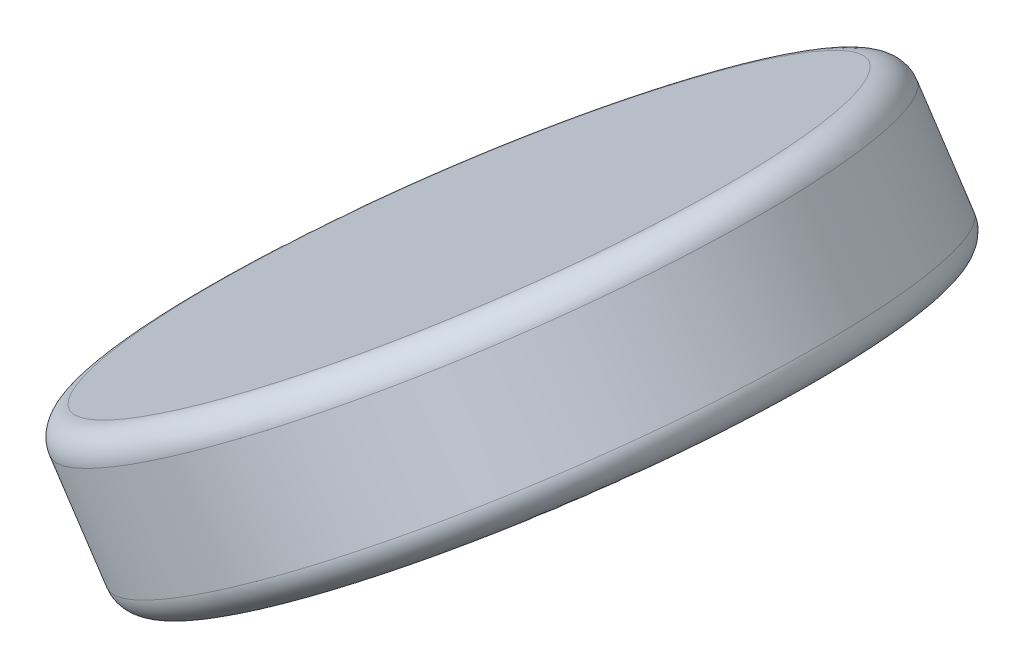
ISO-10303-21;
HEADER;
FILE_DESCRIPTION(('STEP AP214'),'2;1');
FILE_NAME('part.step','',(''),(''),'','','');
FILE_SCHEMA(('AUTOMOTIVE_DESIGN { 1 0 10303 214 1 1 1 1 }'));
ENDSEC;
DATA;
#1=APPLICATION_CONTEXT('core data for automotive mechanical design processes');
#2=APPLICATION_PROTOCOL_DEFINITION('international standard','automotive_design',2000,#1);
#3=PRODUCT_CONTEXT('',#1,'mechanical');
#4=PRODUCT('Part','Part','',(#3));
#5=PRODUCT_RELATED_PRODUCT_CATEGORY('part','',(#4));
#6=PRODUCT_DEFINITION_FORMATION('','',#4);
#7=PRODUCT_DEFINITION_CONTEXT('part definition',#1,'design');
#8=PRODUCT_DEFINITION('design','',#6,#7);
#9=PRODUCT_DEFINITION_SHAPE('','',#8);
#10=(LENGTH_UNIT() NAMED_UNIT(*) SI_UNIT(.MILLI.,.METRE.));
#11=(NAMED_UNIT(*) PLANE_ANGLE_UNIT() SI_UNIT($,.RADIAN.));
#12=(NAMED_UNIT(*) SI_UNIT($,.STERADIAN.) SOLID_ANGLE_UNIT());
#13=UNCERTAINTY_MEASURE_WITH_UNIT(LENGTH_MEASURE(1.E-05),#10,'distance_accuracy_value','');
#14=(GEOMETRIC_REPRESENTATION_CONTEXT(3) GLOBAL_UNCERTAINTY_ASSIGNED_CONTEXT((#13)) GLOBAL_UNIT_ASSIGNED_CONTEXT((#10,
#11,#12)) REPRESENTATION_CONTEXT('',''));
#15=CARTESIAN_POINT('',(0.,0.,0.));
#16=DIRECTION('',(0.,0.,1.));
#17=DIRECTION('',(1.,0.,0.));
#18=AXIS2_PLACEMENT_3D('',#15,#16,#17);
#19=CARTESIAN_POINT('',(72.0948800223047,-6.29929521021948,0.));
#20=DIRECTION('',(-0.555551246362452,0.831482298467698,0.));
#21=DIRECTION('',(-0.831482298467698,-0.555551246362452,0.));
#22=AXIS2_PLACEMENT_3D('',#19,#20,#21);
#23=PLANE('',#22);
#24=CARTESIAN_POINT('',(66.6902450822647,-9.91037831157542,0.));
#25=DIRECTION('',(-0.555551246362452,0.831482298467698,0.));
#26=DIRECTION('',(-0.831482298467698,-0.555551246362452,0.));
#27=AXIS2_PLACEMENT_3D('',#24,#25,#26);
#28=CIRCLE('',#27,6.00000000000001);
#29=CARTESIAN_POINT('',(61.7013512914585,-13.2436857897501,0.));
#30=VERTEX_POINT('',#29);
#31=CARTESIAN_POINT('',(71.6791388730709,-6.5770708334007,0.));
#32=VERTEX_POINT('',#31);
#33=EDGE_CURVE('E42',#30,#32,#28,.T.);
#34=ORIENTED_EDGE('',*,*,#33,.F.);
#35=CARTESIAN_POINT('',(66.6902450822647,-9.91037831157542,0.));
#36=DIRECTION('',(-0.555551246362452,0.831482298467698,0.));
#37=DIRECTION('',(0.831482298467698,0.555551246362451,0.));
#38=AXIS2_PLACEMENT_3D('',#35,#36,#37);
#39=CIRCLE('',#38,6.00000000000002);
#40=EDGE_CURVE('E44',#32,#30,#39,.T.);
#41=ORIENTED_EDGE('',*,*,#40,.F.);
#42=EDGE_LOOP('',(#34,#41));
#43=FACE_BOUND('',#42,.T.);
#44=ADVANCED_FACE('F17',(#43),#23,.F.);
#45=CARTESIAN_POINT('',(66.4124694590834,-9.49463716234157,0.));
#46=DIRECTION('',(-0.555551246362452,0.831482298467698,0.));
#47=DIRECTION('',(-0.831482298467698,-0.555551246362452,0.));
#48=AXIS2_PLACEMENT_3D('',#45,#46,#47);
#49=TOROIDAL_SURFACE('',#48,6.00000000000001,0.5);
#50=ORIENTED_EDGE('',*,*,#33,.T.);
#51=ORIENTED_EDGE('',*,*,#40,.T.);
#52=EDGE_LOOP('',(#50,#51));
#53=FACE_BOUND('',#52,.T.);
#54=CARTESIAN_POINT('',(66.4124694590835,-9.49463716234157,0.));
#55=DIRECTION('',(-0.555551246362452,0.831482298467698,0.));
#56=DIRECTION('',(-0.831482298467698,-0.555551246362452,0.));
#57=AXIS2_PLACEMENT_3D('',#54,#55,#56);
#58=CIRCLE('',#57,6.50000000000001);
#59=CARTESIAN_POINT('',(61.0078345190434,-13.1057202636975,0.));
#60=VERTEX_POINT('',#59);
#61=EDGE_CURVE('E50',#60,#60,#58,.T.);
#62=ORIENTED_EDGE('',*,*,#61,.F.);
#63=EDGE_LOOP('',(#62));
#64=FACE_BOUND('',#63,.T.);
#65=ADVANCED_FACE('F46',(#53,#64),#49,.T.);
#66=CARTESIAN_POINT('',(58.7203402362504,2.01801685146834,0.));
#67=DIRECTION('',(-0.555551246362452,0.831482298467698,0.));
#68=DIRECTION('',(-0.831482298467698,-0.555551246362452,0.));
#69=AXIS2_PLACEMENT_3D('',#66,#67,#68);
#70=CYLINDRICAL_SURFACE('',#69,6.50000000000001);
#71=ORIENTED_EDGE('',*,*,#61,.T.);
#72=EDGE_LOOP('',(#71));
#73=FACE_BOUND('',#72,.T.);
#74=CARTESIAN_POINT('',(65.3013669663585,-7.83167256540617,0.));
#75=DIRECTION('',(0.555551246362452,-0.831482298467698,0.));
#76=DIRECTION('',(0.831482298467698,0.555551246362452,0.));
#77=AXIS2_PLACEMENT_3D('',#74,#75,#76);
#78=CIRCLE('',#77,6.50000000000001);
#79=CARTESIAN_POINT('',(70.7060019063986,-4.22058946405023,0.));
#80=VERTEX_POINT('',#79);
#81=EDGE_CURVE('E112',#80,#80,#78,.F.);
#82=ORIENTED_EDGE('',*,*,#81,.F.);
#83=EDGE_LOOP('',(#82));
#84=FACE_BOUND('',#83,.T.);
#85=ADVANCED_FACE('F76',(#73,#84),#70,.T.);
#86=CARTESIAN_POINT('',(65.3013669663585,-7.83167256540618,0.));
#87=DIRECTION('',(0.555551246362452,-0.831482298467698,0.));
#88=DIRECTION('',(0.831482298467698,0.555551246362451,0.));
#89=AXIS2_PLACEMENT_3D('',#86,#87,#88);
#90=TOROIDAL_SURFACE('',#89,6.00000000000002,0.5);
#91=CARTESIAN_POINT('',(65.0235913431773,-7.41593141617233,0.));
#92=DIRECTION('',(0.555551246362452,-0.831482298467698,0.));
#93=DIRECTION('',(0.831482298467698,0.555551246362452,0.));
#94=AXIS2_PLACEMENT_3D('',#91,#92,#93);
#95=CIRCLE('',#94,6.00000000000002);
#96=CARTESIAN_POINT('',(70.0124851339835,-4.08262393799761,0.));
#97=VERTEX_POINT('',#96);
#98=CARTESIAN_POINT('',(60.0346975523711,-10.749238894347,0.));
#99=VERTEX_POINT('',#98);
#100=EDGE_CURVE('E28',#97,#99,#95,.T.);
#101=ORIENTED_EDGE('',*,*,#100,.T.);
#102=CARTESIAN_POINT('',(65.0235913431773,-7.41593141617233,0.));
#103=DIRECTION('',(0.555551246362452,-0.831482298467698,0.));
#104=DIRECTION('',(-0.831482298467698,-0.555551246362452,0.));
#105=AXIS2_PLACEMENT_3D('',#102,#103,#104);
#106=CIRCLE('',#105,6.00000000000002);
#107=EDGE_CURVE('E11',#99,#97,#106,.T.);
#108=ORIENTED_EDGE('',*,*,#107,.T.);
#109=EDGE_LOOP('',(#101,#108));
#110=FACE_BOUND('',#109,.T.);
#111=ORIENTED_EDGE('',*,*,#81,.T.);
#112=EDGE_LOOP('',(#111));
#113=FACE_BOUND('',#112,.T.);
#114=ADVANCED_FACE('F91',(#110,#113),#90,.T.);
#115=CARTESIAN_POINT('',(65.0235913431773,-7.41593141617233,0.));
#116=DIRECTION('',(0.555551246362452,-0.831482298467698,0.));
#117=DIRECTION('',(0.831482298467698,0.555551246362452,0.));
#118=AXIS2_PLACEMENT_3D('',#115,#116,#117);
#119=PLANE('',#118);
#120=ORIENTED_EDGE('',*,*,#100,.F.);
#121=ORIENTED_EDGE('',*,*,#107,.F.);
#122=EDGE_LOOP('',(#120,#121));
#123=FACE_BOUND('',#122,.T.);
#124=ADVANCED_FACE('F101',(#123),#119,.F.);
#125=CLOSED_SHELL('',(#44,#65,#85,#114,#124));
#126=MANIFOLD_SOLID_BREP('B1',#125);
#127=ADVANCED_BREP_SHAPE_REPRESENTATION('',(#18,#126),#14);
#128=SHAPE_DEFINITION_REPRESENTATION(#9,#127);
ENDSEC;
END-ISO-10303-21;
